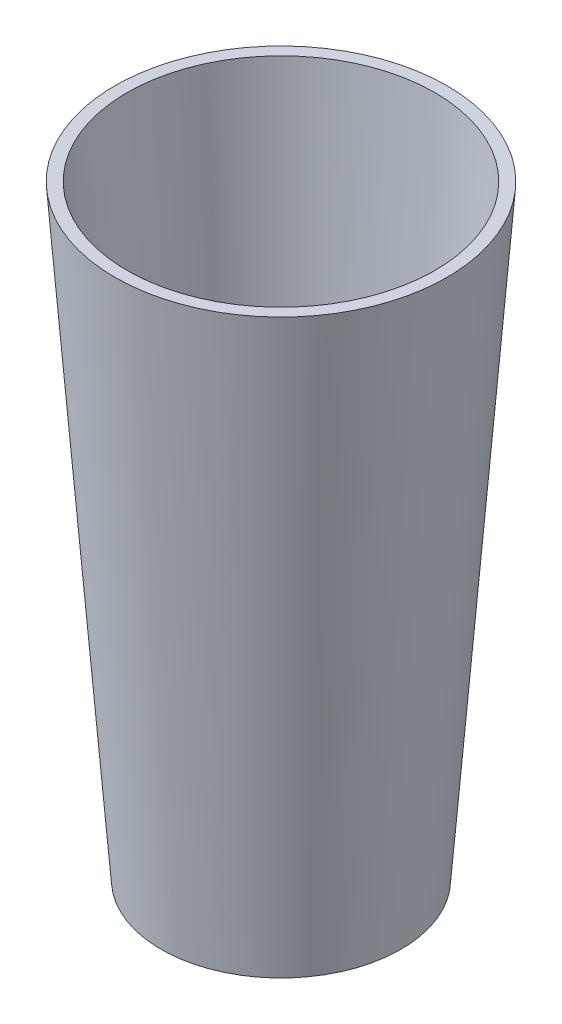
ISO-10303-21;
HEADER;
FILE_DESCRIPTION(('STEP AP214'),'2;1');
FILE_NAME('part.step','',(''),(''),'','','');
FILE_SCHEMA(('AUTOMOTIVE_DESIGN { 1 0 10303 214 1 1 1 1 }'));
ENDSEC;
DATA;
#1=APPLICATION_CONTEXT('core data for automotive mechanical design processes');
#2=APPLICATION_PROTOCOL_DEFINITION('international standard','automotive_design',2000,#1);
#3=PRODUCT_CONTEXT('',#1,'mechanical');
#4=PRODUCT('Part','Part','',(#3));
#5=PRODUCT_RELATED_PRODUCT_CATEGORY('part','',(#4));
#6=PRODUCT_DEFINITION_FORMATION('','',#4);
#7=PRODUCT_DEFINITION_CONTEXT('part definition',#1,'design');
#8=PRODUCT_DEFINITION('design','',#6,#7);
#9=PRODUCT_DEFINITION_SHAPE('','',#8);
#10=(LENGTH_UNIT() NAMED_UNIT(*) SI_UNIT(.MILLI.,.METRE.));
#11=(NAMED_UNIT(*) PLANE_ANGLE_UNIT() SI_UNIT($,.RADIAN.));
#12=(NAMED_UNIT(*) SI_UNIT($,.STERADIAN.) SOLID_ANGLE_UNIT());
#13=UNCERTAINTY_MEASURE_WITH_UNIT(LENGTH_MEASURE(1.E-05),#10,'distance_accuracy_value','');
#14=(GEOMETRIC_REPRESENTATION_CONTEXT(3) GLOBAL_UNCERTAINTY_ASSIGNED_CONTEXT((#13)) GLOBAL_UNIT_ASSIGNED_CONTEXT((#10,
#11,#12)) REPRESENTATION_CONTEXT('',''));
#15=CARTESIAN_POINT('',(0.,0.,0.));
#16=DIRECTION('',(0.,0.,1.));
#17=DIRECTION('',(1.,0.,0.));
#18=AXIS2_PLACEMENT_3D('',#15,#16,#17);
#19=CARTESIAN_POINT('',(-30.,0.,0.));
#20=DIRECTION('',(0.,1.,0.));
#21=DIRECTION('',(0.,0.,1.));
#22=AXIS2_PLACEMENT_3D('',#19,#20,#21);
#23=PLANE('',#22);
#24=CARTESIAN_POINT('',(0.,0.,0.));
#25=DIRECTION('',(0.,-1.,0.));
#26=DIRECTION('',(0.,0.,-1.));
#27=AXIS2_PLACEMENT_3D('',#24,#25,#26);
#28=CIRCLE('',#27,30.);
#29=CARTESIAN_POINT('',(0.,0.,-30.));
#30=VERTEX_POINT('',#29);
#31=EDGE_CURVE('E10',#30,#30,#28,.T.);
#32=ORIENTED_EDGE('',*,*,#31,.T.);
#33=EDGE_LOOP('',(#32));
#34=FACE_BOUND('',#33,.T.);
#35=ADVANCED_FACE('F30',(#34),#23,.F.);
#36=CARTESIAN_POINT('',(0.,151.333,0.));
#37=DIRECTION('',(0.,1.,0.));
#38=DIRECTION('',(0.,0.,1.));
#39=AXIS2_PLACEMENT_3D('',#36,#37,#38);
#40=CONICAL_SURFACE('',#39,41.529,0.0760361134942855);
#41=ORIENTED_EDGE('',*,*,#31,.F.);
#42=EDGE_LOOP('',(#41));
#43=FACE_BOUND('',#42,.T.);
#44=CARTESIAN_POINT('',(0.,151.333,0.));
#45=DIRECTION('',(0.,-1.,0.));
#46=DIRECTION('',(0.,0.,-1.));
#47=AXIS2_PLACEMENT_3D('',#44,#45,#46);
#48=CIRCLE('',#47,41.529);
#49=CARTESIAN_POINT('',(0.,151.333,-41.529));
#50=VERTEX_POINT('',#49);
#51=EDGE_CURVE('E36',#50,#50,#48,.T.);
#52=ORIENTED_EDGE('',*,*,#51,.T.);
#53=EDGE_LOOP('',(#52));
#54=FACE_BOUND('',#53,.T.);
#55=ADVANCED_FACE('F62',(#43,#54),#40,.T.);
#56=CARTESIAN_POINT('',(-41.529,151.333,0.));
#57=DIRECTION('',(0.,-1.,0.));
#58=DIRECTION('',(0.,0.,-1.));
#59=AXIS2_PLACEMENT_3D('',#56,#57,#58);
#60=PLANE('',#59);
#61=ORIENTED_EDGE('',*,*,#51,.F.);
#62=EDGE_LOOP('',(#61));
#63=FACE_BOUND('',#62,.T.);
#64=CARTESIAN_POINT('',(0.,151.333,0.));
#65=DIRECTION('',(0.,-1.,0.));
#66=DIRECTION('',(0.,0.,-1.));
#67=AXIS2_PLACEMENT_3D('',#64,#65,#66);
#68=CIRCLE('',#67,38.5203068239133);
#69=CARTESIAN_POINT('',(0.,151.333,-38.5203068239133));
#70=VERTEX_POINT('',#69);
#71=EDGE_CURVE('E40',#70,#70,#68,.T.);
#72=ORIENTED_EDGE('',*,*,#71,.T.);
#73=EDGE_LOOP('',(#72));
#74=FACE_BOUND('',#73,.T.);
#75=ADVANCED_FACE('F58',(#63,#74),#60,.F.);
#76=CARTESIAN_POINT('',(0.,4.,0.));
#77=DIRECTION('',(0.,1.,0.));
#78=DIRECTION('',(0.,0.,1.));
#79=AXIS2_PLACEMENT_3D('',#76,#77,#78);
#80=CONICAL_SURFACE('',#79,27.296038772662,0.0760361134942856);
#81=ORIENTED_EDGE('',*,*,#71,.F.);
#82=EDGE_LOOP('',(#81));
#83=FACE_BOUND('',#82,.T.);
#84=CARTESIAN_POINT('',(0.,4.,0.));
#85=DIRECTION('',(0.,-1.,0.));
#86=DIRECTION('',(0.,0.,-1.));
#87=AXIS2_PLACEMENT_3D('',#84,#85,#86);
#88=CIRCLE('',#87,27.296038772662);
#89=CARTESIAN_POINT('',(0.,4.,-27.296038772662));
#90=VERTEX_POINT('',#89);
#91=EDGE_CURVE('E44',#90,#90,#88,.T.);
#92=ORIENTED_EDGE('',*,*,#91,.T.);
#93=EDGE_LOOP('',(#92));
#94=FACE_BOUND('',#93,.T.);
#95=ADVANCED_FACE('F50',(#83,#94),#80,.F.);
#96=CARTESIAN_POINT('',(-27.296038772662,4.,0.));
#97=DIRECTION('',(0.,-1.,0.));
#98=DIRECTION('',(0.,0.,-1.));
#99=AXIS2_PLACEMENT_3D('',#96,#97,#98);
#100=PLANE('',#99);
#101=ORIENTED_EDGE('',*,*,#91,.F.);
#102=EDGE_LOOP('',(#101));
#103=FACE_BOUND('',#102,.T.);
#104=ADVANCED_FACE('F52',(#103),#100,.F.);
#105=CLOSED_SHELL('',(#35,#55,#75,#95,#104));
#106=MANIFOLD_SOLID_BREP('B2',#105);
#107=ADVANCED_BREP_SHAPE_REPRESENTATION('',(#18,#106),#14);
#108=SHAPE_DEFINITION_REPRESENTATION(#9,#107);
ENDSEC;
END-ISO-10303-21;
